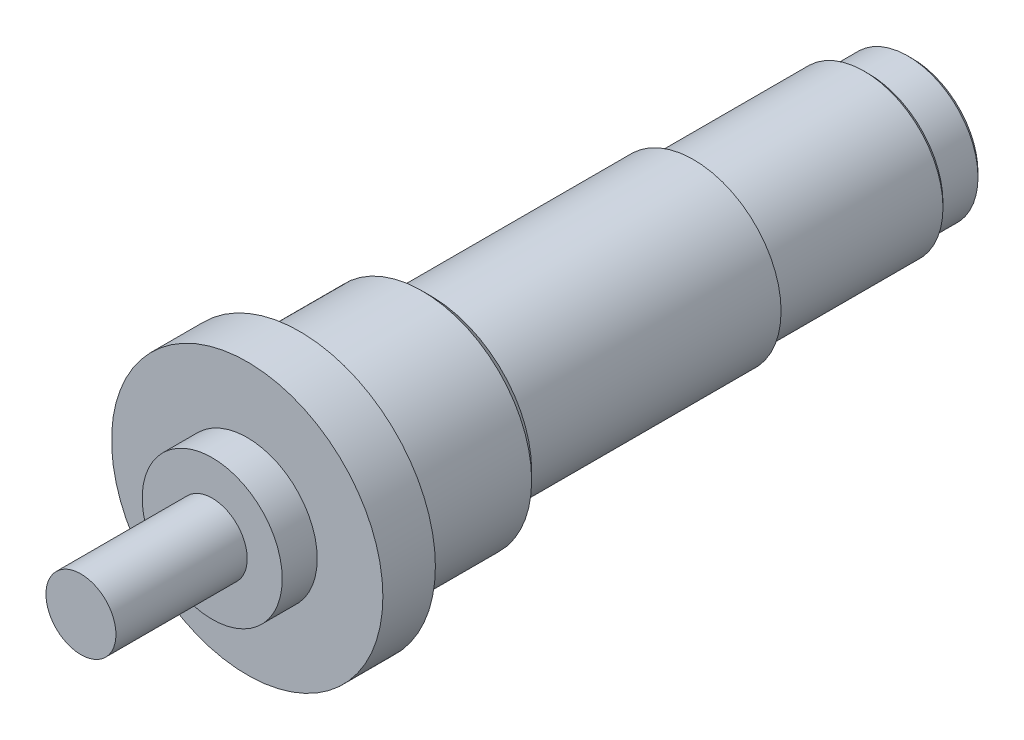
ISO-10303-21;
HEADER;
FILE_DESCRIPTION(('STEP AP214'),'2;1');
FILE_NAME('part.step','',(''),(''),'','','');
FILE_SCHEMA(('AUTOMOTIVE_DESIGN { 1 0 10303 214 1 1 1 1 }'));
ENDSEC;
DATA;
#1=APPLICATION_CONTEXT('core data for automotive mechanical design processes');
#2=APPLICATION_PROTOCOL_DEFINITION('international standard','automotive_design',2000,#1);
#3=PRODUCT_CONTEXT('',#1,'mechanical');
#4=PRODUCT('Part','Part','',(#3));
#5=PRODUCT_RELATED_PRODUCT_CATEGORY('part','',(#4));
#6=PRODUCT_DEFINITION_FORMATION('','',#4);
#7=PRODUCT_DEFINITION_CONTEXT('part definition',#1,'design');
#8=PRODUCT_DEFINITION('design','',#6,#7);
#9=PRODUCT_DEFINITION_SHAPE('','',#8);
#10=(LENGTH_UNIT() NAMED_UNIT(*) SI_UNIT(.MILLI.,.METRE.));
#11=(NAMED_UNIT(*) PLANE_ANGLE_UNIT() SI_UNIT($,.RADIAN.));
#12=(NAMED_UNIT(*) SI_UNIT($,.STERADIAN.) SOLID_ANGLE_UNIT());
#13=UNCERTAINTY_MEASURE_WITH_UNIT(LENGTH_MEASURE(1.E-05),#10,'distance_accuracy_value','');
#14=(GEOMETRIC_REPRESENTATION_CONTEXT(3) GLOBAL_UNCERTAINTY_ASSIGNED_CONTEXT((#13)) GLOBAL_UNIT_ASSIGNED_CONTEXT((#10,
#11,#12)) REPRESENTATION_CONTEXT('',''));
#15=CARTESIAN_POINT('',(0.,0.,0.));
#16=DIRECTION('',(0.,0.,1.));
#17=DIRECTION('',(1.,0.,0.));
#18=AXIS2_PLACEMENT_3D('',#15,#16,#17);
#19=CARTESIAN_POINT('',(0.,0.,47.5));
#20=DIRECTION('',(0.,0.,-1.));
#21=DIRECTION('',(-1.,0.,0.));
#22=AXIS2_PLACEMENT_3D('',#19,#20,#21);
#23=PLANE('',#22);
#24=CARTESIAN_POINT('',(0.,0.,47.5));
#25=DIRECTION('',(0.,0.,1.));
#26=DIRECTION('',(1.,0.,0.));
#27=AXIS2_PLACEMENT_3D('',#24,#25,#26);
#28=CIRCLE('',#27,4.);
#29=CARTESIAN_POINT('',(4.,0.,47.5));
#30=VERTEX_POINT('',#29);
#31=EDGE_CURVE('E84',#30,#30,#28,.T.);
#32=ORIENTED_EDGE('',*,*,#31,.T.);
#33=EDGE_LOOP('',(#32));
#34=FACE_BOUND('',#33,.T.);
#35=ADVANCED_FACE('F51',(#34),#23,.F.);
#36=CARTESIAN_POINT('',(0.,0.,113.714285714286));
#37=DIRECTION('',(0.,0.,1.));
#38=DIRECTION('',(1.,0.,0.));
#39=AXIS2_PLACEMENT_3D('',#36,#37,#38);
#40=CYLINDRICAL_SURFACE('',#39,4.);
#41=ORIENTED_EDGE('',*,*,#31,.F.);
#42=EDGE_LOOP('',(#41));
#43=FACE_BOUND('',#42,.T.);
#44=CARTESIAN_POINT('',(0.,0.,32.5));
#45=DIRECTION('',(0.,0.,1.));
#46=DIRECTION('',(1.,0.,0.));
#47=AXIS2_PLACEMENT_3D('',#44,#45,#46);
#48=CIRCLE('',#47,4.);
#49=CARTESIAN_POINT('',(4.,0.,32.5));
#50=VERTEX_POINT('',#49);
#51=EDGE_CURVE('E88',#50,#50,#48,.T.);
#52=ORIENTED_EDGE('',*,*,#51,.T.);
#53=EDGE_LOOP('',(#52));
#54=FACE_BOUND('',#53,.T.);
#55=ADVANCED_FACE('F145',(#43,#54),#40,.T.);
#56=CARTESIAN_POINT('',(0.,4.,32.5));
#57=DIRECTION('',(0.,0.,-1.));
#58=DIRECTION('',(-1.,0.,0.));
#59=AXIS2_PLACEMENT_3D('',#56,#57,#58);
#60=PLANE('',#59);
#61=ORIENTED_EDGE('',*,*,#51,.F.);
#62=EDGE_LOOP('',(#61));
#63=FACE_BOUND('',#62,.T.);
#64=CARTESIAN_POINT('',(0.,0.,32.5));
#65=DIRECTION('',(0.,0.,1.));
#66=DIRECTION('',(1.,0.,0.));
#67=AXIS2_PLACEMENT_3D('',#64,#65,#66);
#68=CIRCLE('',#67,8.00000000000001);
#69=CARTESIAN_POINT('',(8.00000000000001,0.,32.5));
#70=VERTEX_POINT('',#69);
#71=EDGE_CURVE('E92',#70,#70,#68,.T.);
#72=ORIENTED_EDGE('',*,*,#71,.T.);
#73=EDGE_LOOP('',(#72));
#74=FACE_BOUND('',#73,.T.);
#75=ADVANCED_FACE('F151',(#63,#74),#60,.F.);
#76=CARTESIAN_POINT('',(0.,0.,113.714285714286));
#77=DIRECTION('',(0.,0.,1.));
#78=DIRECTION('',(1.,0.,0.));
#79=AXIS2_PLACEMENT_3D('',#76,#77,#78);
#80=CYLINDRICAL_SURFACE('',#79,8.00000000000001);
#81=ORIENTED_EDGE('',*,*,#71,.F.);
#82=EDGE_LOOP('',(#81));
#83=FACE_BOUND('',#82,.T.);
#84=CARTESIAN_POINT('',(0.,0.,28.5));
#85=DIRECTION('',(0.,0.,1.));
#86=DIRECTION('',(1.,0.,0.));
#87=AXIS2_PLACEMENT_3D('',#84,#85,#86);
#88=CIRCLE('',#87,8.00000000000001);
#89=CARTESIAN_POINT('',(8.00000000000001,0.,28.5));
#90=VERTEX_POINT('',#89);
#91=EDGE_CURVE('E96',#90,#90,#88,.T.);
#92=ORIENTED_EDGE('',*,*,#91,.T.);
#93=EDGE_LOOP('',(#92));
#94=FACE_BOUND('',#93,.T.);
#95=ADVANCED_FACE('F211',(#83,#94),#80,.T.);
#96=CARTESIAN_POINT('',(0.,8.00000000000001,28.5));
#97=DIRECTION('',(0.,0.,-1.));
#98=DIRECTION('',(-1.,0.,0.));
#99=AXIS2_PLACEMENT_3D('',#96,#97,#98);
#100=PLANE('',#99);
#101=ORIENTED_EDGE('',*,*,#91,.F.);
#102=EDGE_LOOP('',(#101));
#103=FACE_BOUND('',#102,.T.);
#104=CARTESIAN_POINT('',(0.,0.,28.5));
#105=DIRECTION('',(0.,0.,1.));
#106=DIRECTION('',(1.,0.,0.));
#107=AXIS2_PLACEMENT_3D('',#104,#105,#106);
#108=CIRCLE('',#107,15.5);
#109=CARTESIAN_POINT('',(15.5,0.,28.5));
#110=VERTEX_POINT('',#109);
#111=EDGE_CURVE('E100',#110,#110,#108,.T.);
#112=ORIENTED_EDGE('',*,*,#111,.T.);
#113=EDGE_LOOP('',(#112));
#114=FACE_BOUND('',#113,.T.);
#115=ADVANCED_FACE('F207',(#103,#114),#100,.F.);
#116=CARTESIAN_POINT('',(0.,0.,113.714285714286));
#117=DIRECTION('',(0.,0.,1.));
#118=DIRECTION('',(1.,0.,0.));
#119=AXIS2_PLACEMENT_3D('',#116,#117,#118);
#120=CYLINDRICAL_SURFACE('',#119,15.5);
#121=ORIENTED_EDGE('',*,*,#111,.F.);
#122=EDGE_LOOP('',(#121));
#123=FACE_BOUND('',#122,.T.);
#124=CARTESIAN_POINT('',(0.,0.,22.5));
#125=DIRECTION('',(0.,0.,1.));
#126=DIRECTION('',(1.,0.,0.));
#127=AXIS2_PLACEMENT_3D('',#124,#125,#126);
#128=CIRCLE('',#127,15.5);
#129=CARTESIAN_POINT('',(15.5,0.,22.5));
#130=VERTEX_POINT('',#129);
#131=EDGE_CURVE('E104',#130,#130,#128,.T.);
#132=ORIENTED_EDGE('',*,*,#131,.T.);
#133=EDGE_LOOP('',(#132));
#134=FACE_BOUND('',#133,.T.);
#135=ADVANCED_FACE('F203',(#123,#134),#120,.T.);
#136=CARTESIAN_POINT('',(0.,15.5,22.5));
#137=DIRECTION('',(0.,0.,1.));
#138=DIRECTION('',(1.,0.,0.));
#139=AXIS2_PLACEMENT_3D('',#136,#137,#138);
#140=PLANE('',#139);
#141=ORIENTED_EDGE('',*,*,#131,.F.);
#142=EDGE_LOOP('',(#141));
#143=FACE_BOUND('',#142,.T.);
#144=CARTESIAN_POINT('',(0.,0.,22.5));
#145=DIRECTION('',(0.,0.,1.));
#146=DIRECTION('',(1.,0.,0.));
#147=AXIS2_PLACEMENT_3D('',#144,#145,#146);
#148=CIRCLE('',#147,12.5);
#149=CARTESIAN_POINT('',(12.5,0.,22.5));
#150=VERTEX_POINT('',#149);
#151=EDGE_CURVE('E108',#150,#150,#148,.T.);
#152=ORIENTED_EDGE('',*,*,#151,.T.);
#153=EDGE_LOOP('',(#152));
#154=FACE_BOUND('',#153,.T.);
#155=ADVANCED_FACE('F199',(#143,#154),#140,.F.);
#156=CARTESIAN_POINT('',(0.,0.,113.714285714286));
#157=DIRECTION('',(0.,0.,1.));
#158=DIRECTION('',(1.,0.,0.));
#159=AXIS2_PLACEMENT_3D('',#156,#157,#158);
#160=CYLINDRICAL_SURFACE('',#159,12.5);
#161=CARTESIAN_POINT('',(0.,0.,8.50000000000001));
#162=DIRECTION('',(0.,0.,1.));
#163=DIRECTION('',(1.,0.,0.));
#164=AXIS2_PLACEMENT_3D('',#161,#162,#163);
#165=CIRCLE('',#164,12.5);
#166=CARTESIAN_POINT('',(12.5,0.,8.50000000000001));
#167=VERTEX_POINT('',#166);
#168=EDGE_CURVE('E80',#167,#167,#165,.T.);
#169=ORIENTED_EDGE('',*,*,#168,.T.);
#170=EDGE_LOOP('',(#169));
#171=FACE_BOUND('',#170,.T.);
#172=ORIENTED_EDGE('',*,*,#151,.F.);
#173=EDGE_LOOP('',(#172));
#174=FACE_BOUND('',#173,.T.);
#175=ADVANCED_FACE('F196',(#171,#174),#160,.T.);
#176=CARTESIAN_POINT('',(0.,12.5,7.5));
#177=DIRECTION('',(0.,0.,1.));
#178=DIRECTION('',(1.,0.,0.));
#179=AXIS2_PLACEMENT_3D('',#176,#177,#178);
#180=PLANE('',#179);
#181=CARTESIAN_POINT('',(0.,0.,7.5));
#182=DIRECTION('',(0.,0.,1.));
#183=DIRECTION('',(1.,0.,0.));
#184=AXIS2_PLACEMENT_3D('',#181,#182,#183);
#185=CIRCLE('',#184,11.5);
#186=CARTESIAN_POINT('',(11.5,0.,7.5));
#187=VERTEX_POINT('',#186);
#188=EDGE_CURVE('E76',#187,#187,#185,.F.);
#189=ORIENTED_EDGE('',*,*,#188,.T.);
#190=EDGE_LOOP('',(#189));
#191=FACE_BOUND('',#190,.T.);
#192=CARTESIAN_POINT('',(0.,0.,7.50000000000001));
#193=DIRECTION('',(0.,0.,1.));
#194=DIRECTION('',(1.,0.,0.));
#195=AXIS2_PLACEMENT_3D('',#192,#193,#194);
#196=CIRCLE('',#195,10.);
#197=CARTESIAN_POINT('',(10.,0.,7.50000000000001));
#198=VERTEX_POINT('',#197);
#199=EDGE_CURVE('E112',#198,#198,#196,.T.);
#200=ORIENTED_EDGE('',*,*,#199,.T.);
#201=EDGE_LOOP('',(#200));
#202=FACE_BOUND('',#201,.T.);
#203=ADVANCED_FACE('F189',(#191,#202),#180,.F.);
#204=CARTESIAN_POINT('',(0.,0.,113.714285714286));
#205=DIRECTION('',(0.,0.,1.));
#206=DIRECTION('',(1.,0.,0.));
#207=AXIS2_PLACEMENT_3D('',#204,#205,#206);
#208=CYLINDRICAL_SURFACE('',#207,10.);
#209=ORIENTED_EDGE('',*,*,#199,.F.);
#210=EDGE_LOOP('',(#209));
#211=FACE_BOUND('',#210,.T.);
#212=CARTESIAN_POINT('',(0.,0.,-22.5));
#213=DIRECTION('',(0.,0.,1.));
#214=DIRECTION('',(1.,0.,0.));
#215=AXIS2_PLACEMENT_3D('',#212,#213,#214);
#216=CIRCLE('',#215,10.);
#217=CARTESIAN_POINT('',(10.,0.,-22.5));
#218=VERTEX_POINT('',#217);
#219=EDGE_CURVE('E116',#218,#218,#216,.T.);
#220=ORIENTED_EDGE('',*,*,#219,.T.);
#221=EDGE_LOOP('',(#220));
#222=FACE_BOUND('',#221,.T.);
#223=ADVANCED_FACE('F182',(#211,#222),#208,.T.);
#224=CARTESIAN_POINT('',(0.,10.,-22.5));
#225=DIRECTION('',(0.,0.,1.));
#226=DIRECTION('',(1.,0.,0.));
#227=AXIS2_PLACEMENT_3D('',#224,#225,#226);
#228=PLANE('',#227);
#229=ORIENTED_EDGE('',*,*,#219,.F.);
#230=EDGE_LOOP('',(#229));
#231=FACE_BOUND('',#230,.T.);
#232=CARTESIAN_POINT('',(0.,0.,-22.5));
#233=DIRECTION('',(0.,0.,1.));
#234=DIRECTION('',(1.,0.,0.));
#235=AXIS2_PLACEMENT_3D('',#232,#233,#234);
#236=CIRCLE('',#235,8.99999999999999);
#237=CARTESIAN_POINT('',(8.99999999999999,0.,-22.5));
#238=VERTEX_POINT('',#237);
#239=EDGE_CURVE('E120',#238,#238,#236,.T.);
#240=ORIENTED_EDGE('',*,*,#239,.T.);
#241=EDGE_LOOP('',(#240));
#242=FACE_BOUND('',#241,.T.);
#243=ADVANCED_FACE('F177',(#231,#242),#228,.F.);
#244=CARTESIAN_POINT('',(0.,0.,113.714285714286));
#245=DIRECTION('',(0.,0.,1.));
#246=DIRECTION('',(1.,0.,0.));
#247=AXIS2_PLACEMENT_3D('',#244,#245,#246);
#248=CYLINDRICAL_SURFACE('',#247,8.99999999999999);
#249=CARTESIAN_POINT('',(0.,0.,-42.));
#250=DIRECTION('',(0.,0.,1.));
#251=DIRECTION('',(1.,0.,0.));
#252=AXIS2_PLACEMENT_3D('',#249,#250,#251);
#253=CIRCLE('',#252,8.99999999999999);
#254=CARTESIAN_POINT('',(8.99999999999999,0.,-42.));
#255=VERTEX_POINT('',#254);
#256=EDGE_CURVE('E70',#255,#255,#253,.T.);
#257=ORIENTED_EDGE('',*,*,#256,.T.);
#258=EDGE_LOOP('',(#257));
#259=FACE_BOUND('',#258,.T.);
#260=ORIENTED_EDGE('',*,*,#239,.F.);
#261=EDGE_LOOP('',(#260));
#262=FACE_BOUND('',#261,.T.);
#263=ADVANCED_FACE('F141',(#259,#262),#248,.T.);
#264=CARTESIAN_POINT('',(0.,8.99999999999999,-42.5));
#265=DIRECTION('',(0.,0.,1.));
#266=DIRECTION('',(1.,0.,0.));
#267=AXIS2_PLACEMENT_3D('',#264,#265,#266);
#268=PLANE('',#267);
#269=CARTESIAN_POINT('',(0.,0.,-42.5));
#270=DIRECTION('',(0.,0.,1.));
#271=DIRECTION('',(1.,0.,0.));
#272=AXIS2_PLACEMENT_3D('',#269,#270,#271);
#273=CIRCLE('',#272,8.49999999999998);
#274=CARTESIAN_POINT('',(8.49999999999998,0.,-42.5));
#275=VERTEX_POINT('',#274);
#276=EDGE_CURVE('E65',#275,#275,#273,.F.);
#277=ORIENTED_EDGE('',*,*,#276,.T.);
#278=EDGE_LOOP('',(#277));
#279=FACE_BOUND('',#278,.T.);
#280=CARTESIAN_POINT('',(0.,0.,-42.5));
#281=DIRECTION('',(0.,0.,1.));
#282=DIRECTION('',(1.,0.,0.));
#283=AXIS2_PLACEMENT_3D('',#280,#281,#282);
#284=CIRCLE('',#283,7.99999999999999);
#285=CARTESIAN_POINT('',(7.99999999999999,0.,-42.5));
#286=VERTEX_POINT('',#285);
#287=EDGE_CURVE('E124',#286,#286,#284,.T.);
#288=ORIENTED_EDGE('',*,*,#287,.T.);
#289=EDGE_LOOP('',(#288));
#290=FACE_BOUND('',#289,.T.);
#291=ADVANCED_FACE('F129',(#279,#290),#268,.F.);
#292=CARTESIAN_POINT('',(0.,0.,113.714285714286));
#293=DIRECTION('',(0.,0.,1.));
#294=DIRECTION('',(1.,0.,0.));
#295=AXIS2_PLACEMENT_3D('',#292,#293,#294);
#296=CYLINDRICAL_SURFACE('',#295,7.99999999999999);
#297=CARTESIAN_POINT('',(0.,0.,-47.));
#298=DIRECTION('',(0.,0.,1.));
#299=DIRECTION('',(1.,0.,0.));
#300=AXIS2_PLACEMENT_3D('',#297,#298,#299);
#301=CIRCLE('',#300,7.99999999999999);
#302=CARTESIAN_POINT('',(7.99999999999999,0.,-47.));
#303=VERTEX_POINT('',#302);
#304=EDGE_CURVE('E60',#303,#303,#301,.T.);
#305=ORIENTED_EDGE('',*,*,#304,.T.);
#306=EDGE_LOOP('',(#305));
#307=FACE_BOUND('',#306,.T.);
#308=ORIENTED_EDGE('',*,*,#287,.F.);
#309=EDGE_LOOP('',(#308));
#310=FACE_BOUND('',#309,.T.);
#311=ADVANCED_FACE('F131',(#307,#310),#296,.T.);
#312=CARTESIAN_POINT('',(0.,7.99999999999999,-47.5));
#313=DIRECTION('',(0.,0.,1.));
#314=DIRECTION('',(1.,0.,0.));
#315=AXIS2_PLACEMENT_3D('',#312,#313,#314);
#316=PLANE('',#315);
#317=CARTESIAN_POINT('',(0.,0.,-47.5));
#318=DIRECTION('',(0.,0.,1.));
#319=DIRECTION('',(1.,0.,0.));
#320=AXIS2_PLACEMENT_3D('',#317,#318,#319);
#321=CIRCLE('',#320,7.49999999999997);
#322=CARTESIAN_POINT('',(7.49999999999997,0.,-47.5));
#323=VERTEX_POINT('',#322);
#324=EDGE_CURVE('E10',#323,#323,#321,.F.);
#325=ORIENTED_EDGE('',*,*,#324,.T.);
#326=EDGE_LOOP('',(#325));
#327=FACE_BOUND('',#326,.T.);
#328=ADVANCED_FACE('F133',(#327),#316,.F.);
#329=CARTESIAN_POINT('',(0.,0.,8.50000000000001));
#330=DIRECTION('',(0.,0.,1.));
#331=DIRECTION('',(1.,0.,0.));
#332=AXIS2_PLACEMENT_3D('',#329,#330,#331);
#333=CONICAL_SURFACE('',#332,12.5,0.785398163397449);
#334=ORIENTED_EDGE('',*,*,#188,.F.);
#335=EDGE_LOOP('',(#334));
#336=FACE_BOUND('',#335,.T.);
#337=ORIENTED_EDGE('',*,*,#168,.F.);
#338=EDGE_LOOP('',(#337));
#339=FACE_BOUND('',#338,.T.);
#340=ADVANCED_FACE('F138',(#336,#339),#333,.T.);
#341=CARTESIAN_POINT('',(0.,0.,-42.));
#342=DIRECTION('',(0.,0.,1.));
#343=DIRECTION('',(1.,0.,0.));
#344=AXIS2_PLACEMENT_3D('',#341,#342,#343);
#345=CONICAL_SURFACE('',#344,8.99999999999999,0.785398163397448);
#346=ORIENTED_EDGE('',*,*,#276,.F.);
#347=EDGE_LOOP('',(#346));
#348=FACE_BOUND('',#347,.T.);
#349=ORIENTED_EDGE('',*,*,#256,.F.);
#350=EDGE_LOOP('',(#349));
#351=FACE_BOUND('',#350,.T.);
#352=ADVANCED_FACE('F161',(#348,#351),#345,.T.);
#353=CARTESIAN_POINT('',(0.,0.,-47.));
#354=DIRECTION('',(0.,0.,1.));
#355=DIRECTION('',(1.,0.,0.));
#356=AXIS2_PLACEMENT_3D('',#353,#354,#355);
#357=CONICAL_SURFACE('',#356,7.99999999999999,0.785398163397462);
#358=ORIENTED_EDGE('',*,*,#324,.F.);
#359=EDGE_LOOP('',(#358));
#360=FACE_BOUND('',#359,.T.);
#361=ORIENTED_EDGE('',*,*,#304,.F.);
#362=EDGE_LOOP('',(#361));
#363=FACE_BOUND('',#362,.T.);
#364=ADVANCED_FACE('F54',(#360,#363),#357,.T.);
#365=CLOSED_SHELL('',(#35,#55,#75,#95,#115,#135,#155,#175,#203,#223,#243,#263,#291,#311,#328,
#340,#352,#364));
#366=MANIFOLD_SOLID_BREP('B2',#365);
#367=ADVANCED_BREP_SHAPE_REPRESENTATION('',(#18,#366),#14);
#368=SHAPE_DEFINITION_REPRESENTATION(#9,#367);
ENDSEC;
END-ISO-10303-21;
